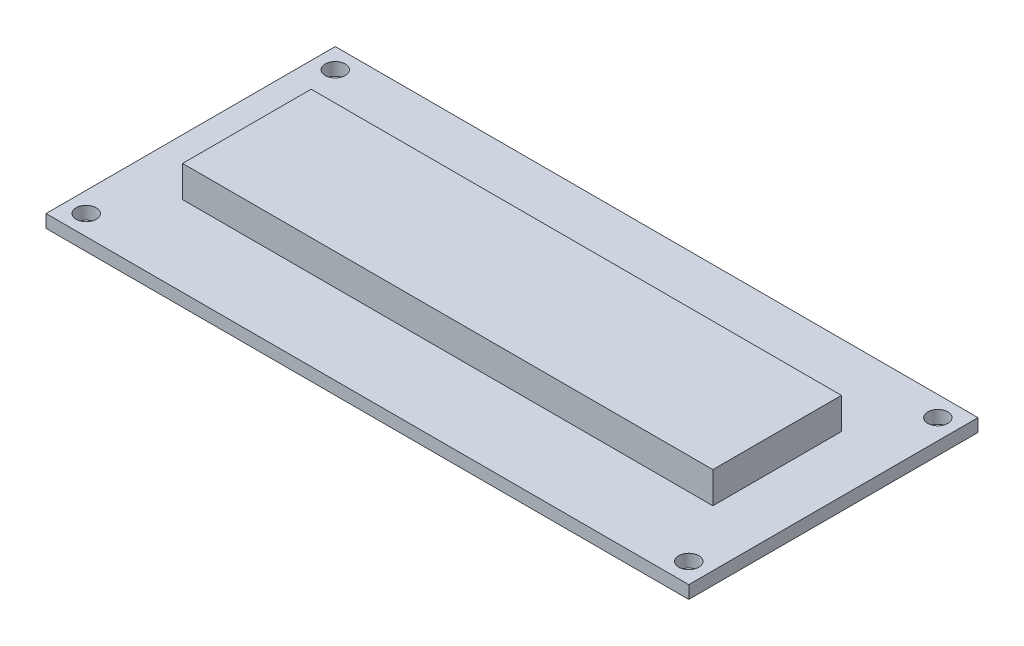
ISO-10303-21;
HEADER;
FILE_DESCRIPTION(('STEP AP214'),'2;1');
FILE_NAME('part.step','',(''),(''),'','','');
FILE_SCHEMA(('AUTOMOTIVE_DESIGN { 1 0 10303 214 1 1 1 1 }'));
ENDSEC;
DATA;
#1=APPLICATION_CONTEXT('core data for automotive mechanical design processes');
#2=APPLICATION_PROTOCOL_DEFINITION('international standard','automotive_design',2000,#1);
#3=PRODUCT_CONTEXT('',#1,'mechanical');
#4=PRODUCT('Part','Part','',(#3));
#5=PRODUCT_RELATED_PRODUCT_CATEGORY('part','',(#4));
#6=PRODUCT_DEFINITION_FORMATION('','',#4);
#7=PRODUCT_DEFINITION_CONTEXT('part definition',#1,'design');
#8=PRODUCT_DEFINITION('design','',#6,#7);
#9=PRODUCT_DEFINITION_SHAPE('','',#8);
#10=(LENGTH_UNIT() NAMED_UNIT(*) SI_UNIT(.MILLI.,.METRE.));
#11=(NAMED_UNIT(*) PLANE_ANGLE_UNIT() SI_UNIT($,.RADIAN.));
#12=(NAMED_UNIT(*) SI_UNIT($,.STERADIAN.) SOLID_ANGLE_UNIT());
#13=UNCERTAINTY_MEASURE_WITH_UNIT(LENGTH_MEASURE(1.E-05),#10,'distance_accuracy_value','');
#14=(GEOMETRIC_REPRESENTATION_CONTEXT(3) GLOBAL_UNCERTAINTY_ASSIGNED_CONTEXT((#13)) GLOBAL_UNIT_ASSIGNED_CONTEXT((#10,
#11,#12)) REPRESENTATION_CONTEXT('',''));
#15=CARTESIAN_POINT('',(0.,0.,0.));
#16=DIRECTION('',(0.,0.,1.));
#17=DIRECTION('',(1.,0.,0.));
#18=AXIS2_PLACEMENT_3D('',#15,#16,#17);
#19=CARTESIAN_POINT('',(40.,1.6,-18.));
#20=DIRECTION('',(-1.,0.,0.));
#21=DIRECTION('',(0.,0.,1.));
#22=AXIS2_PLACEMENT_3D('',#19,#20,#21);
#23=PLANE('',#22);
#24=DIRECTION('',(0.,0.,-1.));
#25=VECTOR('',#24,1.);
#26=CARTESIAN_POINT('',(40.,0.,-18.));
#27=LINE('',#26,#25);
#28=CARTESIAN_POINT('',(40.,0.,18.));
#29=VERTEX_POINT('',#28);
#30=CARTESIAN_POINT('',(40.,0.,-18.));
#31=VERTEX_POINT('',#30);
#32=EDGE_CURVE('E120',#29,#31,#27,.T.);
#33=ORIENTED_EDGE('',*,*,#32,.T.);
#34=DIRECTION('',(0.,-1.,0.));
#35=VECTOR('',#34,1.);
#36=CARTESIAN_POINT('',(40.,1.6,-18.));
#37=LINE('',#36,#35);
#38=CARTESIAN_POINT('',(40.,1.6,-18.));
#39=VERTEX_POINT('',#38);
#40=EDGE_CURVE('E11',#39,#31,#37,.T.);
#41=ORIENTED_EDGE('',*,*,#40,.F.);
#42=DIRECTION('',(0.,0.,-1.));
#43=VECTOR('',#42,1.);
#44=CARTESIAN_POINT('',(40.,1.6,-18.));
#45=LINE('',#44,#43);
#46=CARTESIAN_POINT('',(40.,1.6,18.));
#47=VERTEX_POINT('',#46);
#48=EDGE_CURVE('E129',#47,#39,#45,.T.);
#49=ORIENTED_EDGE('',*,*,#48,.F.);
#50=DIRECTION('',(0.,-1.,0.));
#51=VECTOR('',#50,1.);
#52=CARTESIAN_POINT('',(40.,1.6,18.));
#53=LINE('',#52,#51);
#54=EDGE_CURVE('E138',#47,#29,#53,.T.);
#55=ORIENTED_EDGE('',*,*,#54,.T.);
#56=EDGE_LOOP('',(#33,#41,#49,#55));
#57=FACE_BOUND('',#56,.T.);
#58=ADVANCED_FACE('F34',(#57),#23,.F.);
#59=CARTESIAN_POINT('',(-40.,1.6,-18.));
#60=DIRECTION('',(0.,0.,1.));
#61=DIRECTION('',(1.,0.,0.));
#62=AXIS2_PLACEMENT_3D('',#59,#60,#61);
#63=PLANE('',#62);
#64=DIRECTION('',(-1.,0.,0.));
#65=VECTOR('',#64,1.);
#66=CARTESIAN_POINT('',(-40.,0.,-18.));
#67=LINE('',#66,#65);
#68=CARTESIAN_POINT('',(-40.,0.,-18.));
#69=VERTEX_POINT('',#68);
#70=EDGE_CURVE('E123',#31,#69,#67,.T.);
#71=ORIENTED_EDGE('',*,*,#70,.T.);
#72=DIRECTION('',(0.,-1.,0.));
#73=VECTOR('',#72,1.);
#74=CARTESIAN_POINT('',(-40.,1.6,-18.));
#75=LINE('',#74,#73);
#76=CARTESIAN_POINT('',(-40.,1.6,-18.));
#77=VERTEX_POINT('',#76);
#78=EDGE_CURVE('E42',#77,#69,#75,.T.);
#79=ORIENTED_EDGE('',*,*,#78,.F.);
#80=DIRECTION('',(-1.,0.,0.));
#81=VECTOR('',#80,1.);
#82=CARTESIAN_POINT('',(-40.,1.6,-18.));
#83=LINE('',#82,#81);
#84=EDGE_CURVE('E132',#39,#77,#83,.T.);
#85=ORIENTED_EDGE('',*,*,#84,.F.);
#86=ORIENTED_EDGE('',*,*,#40,.T.);
#87=EDGE_LOOP('',(#71,#79,#85,#86));
#88=FACE_BOUND('',#87,.T.);
#89=ADVANCED_FACE('F205',(#88),#63,.F.);
#90=CARTESIAN_POINT('',(-40.,1.6,-18.));
#91=DIRECTION('',(1.,0.,0.));
#92=DIRECTION('',(0.,0.,-1.));
#93=AXIS2_PLACEMENT_3D('',#90,#91,#92);
#94=PLANE('',#93);
#95=DIRECTION('',(0.,0.,1.));
#96=VECTOR('',#95,1.);
#97=CARTESIAN_POINT('',(-40.,0.,-18.));
#98=LINE('',#97,#96);
#99=CARTESIAN_POINT('',(-40.,0.,18.));
#100=VERTEX_POINT('',#99);
#101=EDGE_CURVE('E141',#69,#100,#98,.T.);
#102=ORIENTED_EDGE('',*,*,#101,.T.);
#103=DIRECTION('',(0.,-1.,0.));
#104=VECTOR('',#103,1.);
#105=CARTESIAN_POINT('',(-40.,1.6,18.));
#106=LINE('',#105,#104);
#107=CARTESIAN_POINT('',(-40.,1.6,18.));
#108=VERTEX_POINT('',#107);
#109=EDGE_CURVE('E146',#108,#100,#106,.T.);
#110=ORIENTED_EDGE('',*,*,#109,.F.);
#111=DIRECTION('',(0.,0.,1.));
#112=VECTOR('',#111,1.);
#113=CARTESIAN_POINT('',(-40.,1.6,-18.));
#114=LINE('',#113,#112);
#115=EDGE_CURVE('E135',#77,#108,#114,.T.);
#116=ORIENTED_EDGE('',*,*,#115,.F.);
#117=ORIENTED_EDGE('',*,*,#78,.T.);
#118=EDGE_LOOP('',(#102,#110,#116,#117));
#119=FACE_BOUND('',#118,.T.);
#120=ADVANCED_FACE('F210',(#119),#94,.F.);
#121=CARTESIAN_POINT('',(-40.,1.6,18.));
#122=DIRECTION('',(0.,0.,-1.));
#123=DIRECTION('',(-1.,0.,0.));
#124=AXIS2_PLACEMENT_3D('',#121,#122,#123);
#125=PLANE('',#124);
#126=DIRECTION('',(1.,0.,0.));
#127=VECTOR('',#126,1.);
#128=CARTESIAN_POINT('',(-40.,0.,18.));
#129=LINE('',#128,#127);
#130=EDGE_CURVE('E133',#100,#29,#129,.T.);
#131=ORIENTED_EDGE('',*,*,#130,.T.);
#132=ORIENTED_EDGE('',*,*,#54,.F.);
#133=DIRECTION('',(1.,0.,0.));
#134=VECTOR('',#133,1.);
#135=CARTESIAN_POINT('',(-40.,1.6,18.));
#136=LINE('',#135,#134);
#137=EDGE_CURVE('E137',#108,#47,#136,.T.);
#138=ORIENTED_EDGE('',*,*,#137,.F.);
#139=ORIENTED_EDGE('',*,*,#109,.T.);
#140=EDGE_LOOP('',(#131,#132,#138,#139));
#141=FACE_BOUND('',#140,.T.);
#142=ADVANCED_FACE('F194',(#141),#125,.F.);
#143=CARTESIAN_POINT('',(0.,1.6,0.));
#144=DIRECTION('',(0.,1.,0.));
#145=DIRECTION('',(0.,0.,1.));
#146=AXIS2_PLACEMENT_3D('',#143,#144,#145);
#147=PLANE('',#146);
#148=CARTESIAN_POINT('',(37.5,1.6,15.5));
#149=DIRECTION('',(0.,1.,0.));
#150=DIRECTION('',(0.,0.,-1.));
#151=AXIS2_PLACEMENT_3D('',#148,#149,#150);
#152=CIRCLE('',#151,1.25);
#153=CARTESIAN_POINT('',(37.5,1.6,14.25));
#154=VERTEX_POINT('',#153);
#155=EDGE_CURVE('E170',#154,#154,#152,.T.);
#156=ORIENTED_EDGE('',*,*,#155,.F.);
#157=EDGE_LOOP('',(#156));
#158=FACE_BOUND('',#157,.T.);
#159=CARTESIAN_POINT('',(-37.5,1.6,15.5));
#160=DIRECTION('',(0.,-1.,0.));
#161=DIRECTION('',(0.,0.,-1.));
#162=AXIS2_PLACEMENT_3D('',#159,#160,#161);
#163=CIRCLE('',#162,1.25);
#164=CARTESIAN_POINT('',(-37.5,1.6,14.25));
#165=VERTEX_POINT('',#164);
#166=EDGE_CURVE('E160',#165,#165,#163,.T.);
#167=ORIENTED_EDGE('',*,*,#166,.T.);
#168=EDGE_LOOP('',(#167));
#169=FACE_BOUND('',#168,.T.);
#170=CARTESIAN_POINT('',(37.5,1.6,-15.5));
#171=DIRECTION('',(0.,-1.,0.));
#172=DIRECTION('',(0.,0.,1.));
#173=AXIS2_PLACEMENT_3D('',#170,#171,#172);
#174=CIRCLE('',#173,1.25);
#175=CARTESIAN_POINT('',(37.5,1.6,-14.25));
#176=VERTEX_POINT('',#175);
#177=EDGE_CURVE('E157',#176,#176,#174,.T.);
#178=ORIENTED_EDGE('',*,*,#177,.T.);
#179=EDGE_LOOP('',(#178));
#180=FACE_BOUND('',#179,.T.);
#181=CARTESIAN_POINT('',(-37.5,1.6,-15.5));
#182=DIRECTION('',(0.,1.,0.));
#183=DIRECTION('',(0.,0.,1.));
#184=AXIS2_PLACEMENT_3D('',#181,#182,#183);
#185=CIRCLE('',#184,1.25);
#186=CARTESIAN_POINT('',(-37.5,1.6,-14.25));
#187=VERTEX_POINT('',#186);
#188=EDGE_CURVE('E154',#187,#187,#185,.T.);
#189=ORIENTED_EDGE('',*,*,#188,.F.);
#190=EDGE_LOOP('',(#189));
#191=FACE_BOUND('',#190,.T.);
#192=DIRECTION('',(0.,0.,-1.));
#193=VECTOR('',#192,1.);
#194=CARTESIAN_POINT('',(33.,1.6,-8.00000000000001));
#195=LINE('',#194,#193);
#196=CARTESIAN_POINT('',(33.,1.6,8.00000000000001));
#197=VERTEX_POINT('',#196);
#198=CARTESIAN_POINT('',(33.,1.6,-8.00000000000001));
#199=VERTEX_POINT('',#198);
#200=EDGE_CURVE('E50',#197,#199,#195,.T.);
#201=ORIENTED_EDGE('',*,*,#200,.F.);
#202=DIRECTION('',(1.,0.,0.));
#203=VECTOR('',#202,1.);
#204=CARTESIAN_POINT('',(-33.,1.6,8.00000000000001));
#205=LINE('',#204,#203);
#206=CARTESIAN_POINT('',(-33.,1.6,8.00000000000001));
#207=VERTEX_POINT('',#206);
#208=EDGE_CURVE('E54',#207,#197,#205,.T.);
#209=ORIENTED_EDGE('',*,*,#208,.F.);
#210=DIRECTION('',(0.,0.,1.));
#211=VECTOR('',#210,1.);
#212=CARTESIAN_POINT('',(-33.,1.6,-8.00000000000001));
#213=LINE('',#212,#211);
#214=CARTESIAN_POINT('',(-33.,1.6,-8.00000000000001));
#215=VERTEX_POINT('',#214);
#216=EDGE_CURVE('E181',#215,#207,#213,.T.);
#217=ORIENTED_EDGE('',*,*,#216,.F.);
#218=DIRECTION('',(-1.,0.,0.));
#219=VECTOR('',#218,1.);
#220=CARTESIAN_POINT('',(-33.,1.6,-8.00000000000001));
#221=LINE('',#220,#219);
#222=EDGE_CURVE('E179',#199,#215,#221,.T.);
#223=ORIENTED_EDGE('',*,*,#222,.F.);
#224=EDGE_LOOP('',(#201,#209,#217,#223));
#225=FACE_BOUND('',#224,.T.);
#226=ORIENTED_EDGE('',*,*,#48,.T.);
#227=ORIENTED_EDGE('',*,*,#84,.T.);
#228=ORIENTED_EDGE('',*,*,#115,.T.);
#229=ORIENTED_EDGE('',*,*,#137,.T.);
#230=EDGE_LOOP('',(#226,#227,#228,#229));
#231=FACE_BOUND('',#230,.T.);
#232=ADVANCED_FACE('F190',(#158,#169,#180,#191,#225,#231),#147,.T.);
#233=CARTESIAN_POINT('',(0.,0.,0.));
#234=DIRECTION('',(0.,1.,0.));
#235=DIRECTION('',(0.,0.,1.));
#236=AXIS2_PLACEMENT_3D('',#233,#234,#235);
#237=PLANE('',#236);
#238=CARTESIAN_POINT('',(37.5,0.,15.5));
#239=DIRECTION('',(0.,1.,0.));
#240=DIRECTION('',(0.,0.,1.));
#241=AXIS2_PLACEMENT_3D('',#238,#239,#240);
#242=CIRCLE('',#241,1.25);
#243=CARTESIAN_POINT('',(37.5,0.,16.75));
#244=VERTEX_POINT('',#243);
#245=EDGE_CURVE('E37',#244,#244,#242,.T.);
#246=ORIENTED_EDGE('',*,*,#245,.T.);
#247=EDGE_LOOP('',(#246));
#248=FACE_BOUND('',#247,.T.);
#249=CARTESIAN_POINT('',(-37.5,0.,15.5));
#250=DIRECTION('',(0.,1.,0.));
#251=DIRECTION('',(0.,0.,1.));
#252=AXIS2_PLACEMENT_3D('',#249,#250,#251);
#253=CIRCLE('',#252,1.25);
#254=CARTESIAN_POINT('',(-37.5,0.,16.75));
#255=VERTEX_POINT('',#254);
#256=EDGE_CURVE('E158',#255,#255,#253,.F.);
#257=ORIENTED_EDGE('',*,*,#256,.F.);
#258=EDGE_LOOP('',(#257));
#259=FACE_BOUND('',#258,.T.);
#260=CARTESIAN_POINT('',(37.5,0.,-15.5));
#261=DIRECTION('',(0.,1.,0.));
#262=DIRECTION('',(0.,0.,1.));
#263=AXIS2_PLACEMENT_3D('',#260,#261,#262);
#264=CIRCLE('',#263,1.25);
#265=CARTESIAN_POINT('',(37.5,0.,-14.25));
#266=VERTEX_POINT('',#265);
#267=EDGE_CURVE('E155',#266,#266,#264,.F.);
#268=ORIENTED_EDGE('',*,*,#267,.F.);
#269=EDGE_LOOP('',(#268));
#270=FACE_BOUND('',#269,.T.);
#271=CARTESIAN_POINT('',(-37.5,0.,-15.5));
#272=DIRECTION('',(0.,1.,0.));
#273=DIRECTION('',(0.,0.,1.));
#274=AXIS2_PLACEMENT_3D('',#271,#272,#273);
#275=CIRCLE('',#274,1.25);
#276=CARTESIAN_POINT('',(-37.5,0.,-14.25));
#277=VERTEX_POINT('',#276);
#278=EDGE_CURVE('E151',#277,#277,#275,.T.);
#279=ORIENTED_EDGE('',*,*,#278,.T.);
#280=EDGE_LOOP('',(#279));
#281=FACE_BOUND('',#280,.T.);
#282=ORIENTED_EDGE('',*,*,#32,.F.);
#283=ORIENTED_EDGE('',*,*,#130,.F.);
#284=ORIENTED_EDGE('',*,*,#101,.F.);
#285=ORIENTED_EDGE('',*,*,#70,.F.);
#286=EDGE_LOOP('',(#282,#283,#284,#285));
#287=FACE_BOUND('',#286,.T.);
#288=ADVANCED_FACE('F193',(#248,#259,#270,#281,#287),#237,.F.);
#289=CARTESIAN_POINT('',(33.,5.5,-8.00000000000001));
#290=DIRECTION('',(-1.,0.,0.));
#291=DIRECTION('',(0.,0.,1.));
#292=AXIS2_PLACEMENT_3D('',#289,#290,#291);
#293=PLANE('',#292);
#294=ORIENTED_EDGE('',*,*,#200,.T.);
#295=DIRECTION('',(0.,-1.,0.));
#296=VECTOR('',#295,1.);
#297=CARTESIAN_POINT('',(33.,5.5,-8.00000000000001));
#298=LINE('',#297,#296);
#299=CARTESIAN_POINT('',(33.,5.5,-8.00000000000001));
#300=VERTEX_POINT('',#299);
#301=EDGE_CURVE('E103',#300,#199,#298,.T.);
#302=ORIENTED_EDGE('',*,*,#301,.F.);
#303=DIRECTION('',(0.,0.,-1.));
#304=VECTOR('',#303,1.);
#305=CARTESIAN_POINT('',(33.,5.5,-8.00000000000001));
#306=LINE('',#305,#304);
#307=CARTESIAN_POINT('',(33.,5.5,8.00000000000001));
#308=VERTEX_POINT('',#307);
#309=EDGE_CURVE('E109',#308,#300,#306,.T.);
#310=ORIENTED_EDGE('',*,*,#309,.F.);
#311=DIRECTION('',(0.,-1.,0.));
#312=VECTOR('',#311,1.);
#313=CARTESIAN_POINT('',(33.,5.5,8.00000000000001));
#314=LINE('',#313,#312);
#315=EDGE_CURVE('E177',#308,#197,#314,.T.);
#316=ORIENTED_EDGE('',*,*,#315,.T.);
#317=EDGE_LOOP('',(#294,#302,#310,#316));
#318=FACE_BOUND('',#317,.T.);
#319=ADVANCED_FACE('F119',(#318),#293,.F.);
#320=CARTESIAN_POINT('',(-33.,5.5,-8.00000000000001));
#321=DIRECTION('',(0.,0.,1.));
#322=DIRECTION('',(1.,0.,0.));
#323=AXIS2_PLACEMENT_3D('',#320,#321,#322);
#324=PLANE('',#323);
#325=ORIENTED_EDGE('',*,*,#222,.T.);
#326=DIRECTION('',(0.,-1.,0.));
#327=VECTOR('',#326,1.);
#328=CARTESIAN_POINT('',(-33.,5.5,-8.00000000000001));
#329=LINE('',#328,#327);
#330=CARTESIAN_POINT('',(-33.,5.5,-8.00000000000001));
#331=VERTEX_POINT('',#330);
#332=EDGE_CURVE('E105',#331,#215,#329,.T.);
#333=ORIENTED_EDGE('',*,*,#332,.F.);
#334=DIRECTION('',(-1.,0.,0.));
#335=VECTOR('',#334,1.);
#336=CARTESIAN_POINT('',(-33.,5.5,-8.00000000000001));
#337=LINE('',#336,#335);
#338=EDGE_CURVE('E98',#300,#331,#337,.T.);
#339=ORIENTED_EDGE('',*,*,#338,.F.);
#340=ORIENTED_EDGE('',*,*,#301,.T.);
#341=EDGE_LOOP('',(#325,#333,#339,#340));
#342=FACE_BOUND('',#341,.T.);
#343=ADVANCED_FACE('F101',(#342),#324,.F.);
#344=CARTESIAN_POINT('',(-33.,5.5,-8.00000000000001));
#345=DIRECTION('',(1.,0.,0.));
#346=DIRECTION('',(0.,0.,-1.));
#347=AXIS2_PLACEMENT_3D('',#344,#345,#346);
#348=PLANE('',#347);
#349=ORIENTED_EDGE('',*,*,#216,.T.);
#350=DIRECTION('',(0.,-1.,0.));
#351=VECTOR('',#350,1.);
#352=CARTESIAN_POINT('',(-33.,5.5,8.00000000000001));
#353=LINE('',#352,#351);
#354=CARTESIAN_POINT('',(-33.,5.5,8.00000000000001));
#355=VERTEX_POINT('',#354);
#356=EDGE_CURVE('E125',#355,#207,#353,.T.);
#357=ORIENTED_EDGE('',*,*,#356,.F.);
#358=DIRECTION('',(0.,0.,1.));
#359=VECTOR('',#358,1.);
#360=CARTESIAN_POINT('',(-33.,5.5,-8.00000000000001));
#361=LINE('',#360,#359);
#362=EDGE_CURVE('E108',#331,#355,#361,.T.);
#363=ORIENTED_EDGE('',*,*,#362,.F.);
#364=ORIENTED_EDGE('',*,*,#332,.T.);
#365=EDGE_LOOP('',(#349,#357,#363,#364));
#366=FACE_BOUND('',#365,.T.);
#367=ADVANCED_FACE('F189',(#366),#348,.F.);
#368=CARTESIAN_POINT('',(-33.,5.5,8.00000000000001));
#369=DIRECTION('',(0.,0.,-1.));
#370=DIRECTION('',(-1.,0.,0.));
#371=AXIS2_PLACEMENT_3D('',#368,#369,#370);
#372=PLANE('',#371);
#373=ORIENTED_EDGE('',*,*,#208,.T.);
#374=ORIENTED_EDGE('',*,*,#315,.F.);
#375=DIRECTION('',(1.,0.,0.));
#376=VECTOR('',#375,1.);
#377=CARTESIAN_POINT('',(-33.,5.5,8.00000000000001));
#378=LINE('',#377,#376);
#379=EDGE_CURVE('E114',#355,#308,#378,.T.);
#380=ORIENTED_EDGE('',*,*,#379,.F.);
#381=ORIENTED_EDGE('',*,*,#356,.T.);
#382=EDGE_LOOP('',(#373,#374,#380,#381));
#383=FACE_BOUND('',#382,.T.);
#384=ADVANCED_FACE('F187',(#383),#372,.F.);
#385=CARTESIAN_POINT('',(0.,5.5,0.));
#386=DIRECTION('',(0.,1.,0.));
#387=DIRECTION('',(0.,0.,1.));
#388=AXIS2_PLACEMENT_3D('',#385,#386,#387);
#389=PLANE('',#388);
#390=ORIENTED_EDGE('',*,*,#309,.T.);
#391=ORIENTED_EDGE('',*,*,#338,.T.);
#392=ORIENTED_EDGE('',*,*,#362,.T.);
#393=ORIENTED_EDGE('',*,*,#379,.T.);
#394=EDGE_LOOP('',(#390,#391,#392,#393));
#395=FACE_BOUND('',#394,.T.);
#396=ADVANCED_FACE('F112',(#395),#389,.T.);
#397=CARTESIAN_POINT('',(-37.5,-3.3,-15.5));
#398=DIRECTION('',(0.,1.,0.));
#399=DIRECTION('',(0.,0.,1.));
#400=AXIS2_PLACEMENT_3D('',#397,#398,#399);
#401=CYLINDRICAL_SURFACE('',#400,1.25);
#402=ORIENTED_EDGE('',*,*,#188,.T.);
#403=EDGE_LOOP('',(#402));
#404=FACE_BOUND('',#403,.T.);
#405=ORIENTED_EDGE('',*,*,#278,.F.);
#406=EDGE_LOOP('',(#405));
#407=FACE_BOUND('',#406,.T.);
#408=ADVANCED_FACE('F280',(#404,#407),#401,.F.);
#409=CARTESIAN_POINT('',(37.5,-3.3,-15.5));
#410=DIRECTION('',(0.,1.,0.));
#411=DIRECTION('',(0.,0.,1.));
#412=AXIS2_PLACEMENT_3D('',#409,#410,#411);
#413=CYLINDRICAL_SURFACE('',#412,1.25);
#414=ORIENTED_EDGE('',*,*,#177,.F.);
#415=EDGE_LOOP('',(#414));
#416=FACE_BOUND('',#415,.T.);
#417=ORIENTED_EDGE('',*,*,#267,.T.);
#418=EDGE_LOOP('',(#417));
#419=FACE_BOUND('',#418,.T.);
#420=ADVANCED_FACE('F247',(#416,#419),#413,.F.);
#421=CARTESIAN_POINT('',(-37.5,-3.3,15.5));
#422=DIRECTION('',(0.,1.,0.));
#423=DIRECTION('',(0.,0.,1.));
#424=AXIS2_PLACEMENT_3D('',#421,#422,#423);
#425=CYLINDRICAL_SURFACE('',#424,1.25);
#426=ORIENTED_EDGE('',*,*,#166,.F.);
#427=EDGE_LOOP('',(#426));
#428=FACE_BOUND('',#427,.T.);
#429=ORIENTED_EDGE('',*,*,#256,.T.);
#430=EDGE_LOOP('',(#429));
#431=FACE_BOUND('',#430,.T.);
#432=ADVANCED_FACE('F257',(#428,#431),#425,.F.);
#433=CARTESIAN_POINT('',(37.5,-3.3,15.5));
#434=DIRECTION('',(0.,1.,0.));
#435=DIRECTION('',(0.,0.,1.));
#436=AXIS2_PLACEMENT_3D('',#433,#434,#435);
#437=CYLINDRICAL_SURFACE('',#436,1.25);
#438=ORIENTED_EDGE('',*,*,#155,.T.);
#439=EDGE_LOOP('',(#438));
#440=FACE_BOUND('',#439,.T.);
#441=ORIENTED_EDGE('',*,*,#245,.F.);
#442=EDGE_LOOP('',(#441));
#443=FACE_BOUND('',#442,.T.);
#444=ADVANCED_FACE('F262',(#440,#443),#437,.F.);
#445=CLOSED_SHELL('',(#58,#89,#120,#142,#232,#288,#319,#343,#367,#384,#396,#408,#420,#432,#444));
#446=MANIFOLD_SOLID_BREP('B2',#445);
#447=ADVANCED_BREP_SHAPE_REPRESENTATION('',(#18,#446),#14);
#448=SHAPE_DEFINITION_REPRESENTATION(#9,#447);
ENDSEC;
END-ISO-10303-21;
